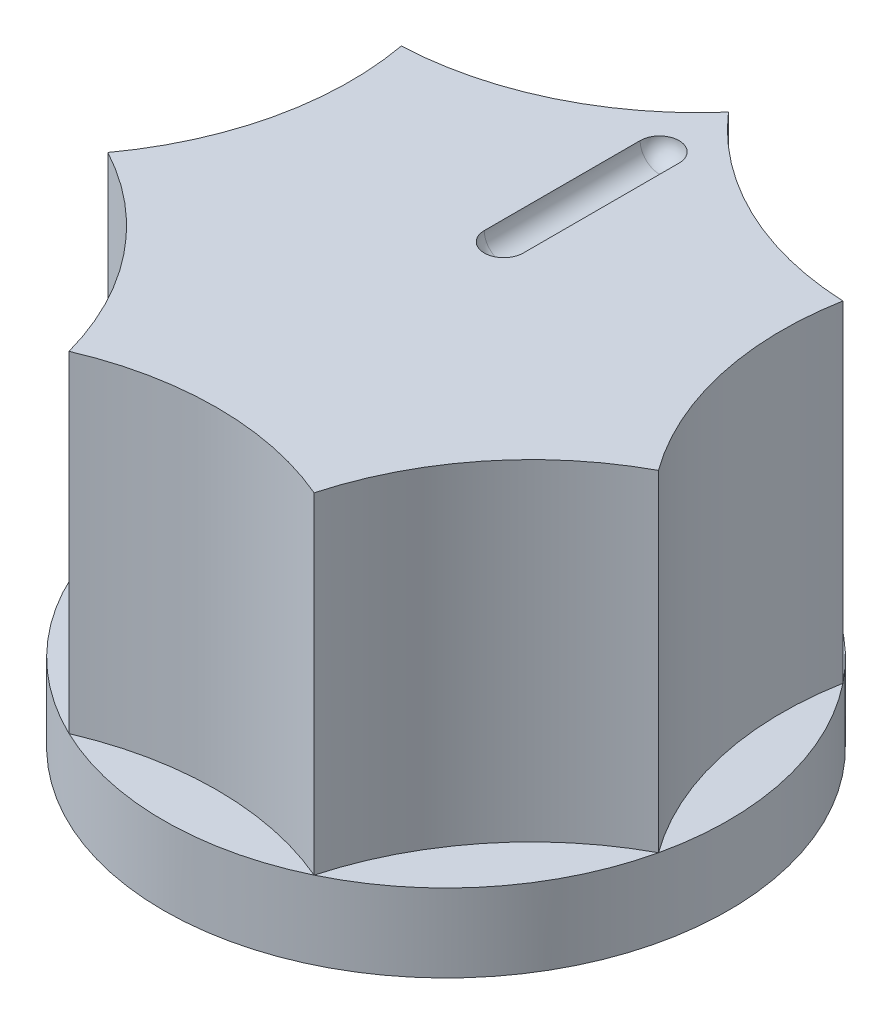
ISO-10303-21;
HEADER;
FILE_DESCRIPTION(('STEP AP214'),'2;1');
FILE_NAME('part.step','',(''),(''),'','','');
FILE_SCHEMA(('AUTOMOTIVE_DESIGN { 1 0 10303 214 1 1 1 1 }'));
ENDSEC;
DATA;
#1=APPLICATION_CONTEXT('core data for automotive mechanical design processes');
#2=APPLICATION_PROTOCOL_DEFINITION('international standard','automotive_design',2000,#1);
#3=PRODUCT_CONTEXT('',#1,'mechanical');
#4=PRODUCT('Part','Part','',(#3));
#5=PRODUCT_RELATED_PRODUCT_CATEGORY('part','',(#4));
#6=PRODUCT_DEFINITION_FORMATION('','',#4);
#7=PRODUCT_DEFINITION_CONTEXT('part definition',#1,'design');
#8=PRODUCT_DEFINITION('design','',#6,#7);
#9=PRODUCT_DEFINITION_SHAPE('','',#8);
#10=(LENGTH_UNIT() NAMED_UNIT(*) SI_UNIT(.MILLI.,.METRE.));
#11=(NAMED_UNIT(*) PLANE_ANGLE_UNIT() SI_UNIT($,.RADIAN.));
#12=(NAMED_UNIT(*) SI_UNIT($,.STERADIAN.) SOLID_ANGLE_UNIT());
#13=UNCERTAINTY_MEASURE_WITH_UNIT(LENGTH_MEASURE(1.E-05),#10,'distance_accuracy_value','');
#14=(GEOMETRIC_REPRESENTATION_CONTEXT(3) GLOBAL_UNCERTAINTY_ASSIGNED_CONTEXT((#13)) GLOBAL_UNIT_ASSIGNED_CONTEXT((#10,
#11,#12)) REPRESENTATION_CONTEXT('',''));
#15=CARTESIAN_POINT('',(0.,0.,0.));
#16=DIRECTION('',(0.,0.,1.));
#17=DIRECTION('',(1.,0.,0.));
#18=AXIS2_PLACEMENT_3D('',#15,#16,#17);
#19=CARTESIAN_POINT('',(0.,2.,0.));
#20=DIRECTION('',(0.,1.,0.));
#21=DIRECTION('',(0.,0.,1.));
#22=AXIS2_PLACEMENT_3D('',#19,#20,#21);
#23=PLANE('',#22);
#24=CARTESIAN_POINT('',(-6.01234166844172,2.,-12.484756118023));
#25=DIRECTION('',(0.,-1.,0.));
#26=DIRECTION('',(0.,0.,1.));
#27=AXIS2_PLACEMENT_3D('',#24,#25,#26);
#28=CIRCLE('',#27,7.97188333791098);
#29=CARTESIAN_POINT('',(0.,2.,-7.25));
#30=VERTEX_POINT('',#29);
#31=CARTESIAN_POINT('',(-5.6682782478931,2.,-4.52030106347596));
#32=VERTEX_POINT('',#31);
#33=EDGE_CURVE('E127',#30,#32,#28,.T.);
#34=ORIENTED_EDGE('',*,*,#33,.F.);
#35=CARTESIAN_POINT('',(0.,2.,0.));
#36=DIRECTION('',(0.,1.,0.));
#37=DIRECTION('',(0.,0.,1.));
#38=AXIS2_PLACEMENT_3D('',#35,#36,#37);
#39=CIRCLE('',#38,7.25);
#40=EDGE_CURVE('E136',#30,#32,#39,.T.);
#41=ORIENTED_EDGE('',*,*,#40,.T.);
#42=EDGE_LOOP('',(#34,#41));
#43=FACE_BOUND('',#42,.T.);
#44=ADVANCED_FACE('F33',(#43),#23,.T.);
#45=CARTESIAN_POINT('',(6.0123416684418,2.,-12.4847561180229));
#46=DIRECTION('',(0.,-1.,0.));
#47=DIRECTION('',(0.,0.,1.));
#48=AXIS2_PLACEMENT_3D('',#45,#46,#47);
#49=CIRCLE('',#48,7.97188333791082);
#50=CARTESIAN_POINT('',(5.66827824789321,2.,-4.52030106347583));
#51=VERTEX_POINT('',#50);
#52=EDGE_CURVE('E179',#51,#30,#49,.T.);
#53=ORIENTED_EDGE('',*,*,#52,.F.);
#54=EDGE_CURVE('E145',#51,#30,#39,.T.);
#55=ORIENTED_EDGE('',*,*,#54,.T.);
#56=EDGE_LOOP('',(#53,#55));
#57=FACE_BOUND('',#56,.T.);
#58=ADVANCED_FACE('F230',(#57),#23,.T.);
#59=CARTESIAN_POINT('',(13.5096090995695,2.,-3.08348011853853));
#60=DIRECTION('',(0.,-1.,0.));
#61=DIRECTION('',(0.,0.,1.));
#62=AXIS2_PLACEMENT_3D('',#59,#60,#61);
#63=CIRCLE('',#62,7.97188333791082);
#64=CARTESIAN_POINT('',(7.06822736331818,2.,1.61327677118343));
#65=VERTEX_POINT('',#64);
#66=EDGE_CURVE('E176',#65,#51,#63,.T.);
#67=ORIENTED_EDGE('',*,*,#66,.F.);
#68=EDGE_CURVE('E199',#65,#51,#39,.T.);
#69=ORIENTED_EDGE('',*,*,#68,.T.);
#70=EDGE_LOOP('',(#67,#69));
#71=FACE_BOUND('',#70,.T.);
#72=ADVANCED_FACE('F235',(#71),#23,.T.);
#73=CARTESIAN_POINT('',(10.8338653329174,2.,8.63971930173714));
#74=DIRECTION('',(0.,-1.,0.));
#75=DIRECTION('',(0.,0.,1.));
#76=AXIS2_PLACEMENT_3D('',#73,#74,#75);
#77=CIRCLE('',#76,7.97188333791087);
#78=CARTESIAN_POINT('',(3.14565710860257,2.,6.5320242922924));
#79=VERTEX_POINT('',#78);
#80=EDGE_CURVE('E173',#79,#65,#77,.T.);
#81=ORIENTED_EDGE('',*,*,#80,.F.);
#82=EDGE_CURVE('E196',#79,#65,#39,.T.);
#83=ORIENTED_EDGE('',*,*,#82,.T.);
#84=EDGE_LOOP('',(#81,#83));
#85=FACE_BOUND('',#84,.T.);
#86=ADVANCED_FACE('F252',(#85),#23,.T.);
#87=CARTESIAN_POINT('',(0.,2.,13.8570338696488));
#88=DIRECTION('',(0.,-1.,0.));
#89=DIRECTION('',(0.,0.,1.));
#90=AXIS2_PLACEMENT_3D('',#87,#88,#89);
#91=CIRCLE('',#90,7.97188333791107);
#92=CARTESIAN_POINT('',(-3.14565710860227,2.,6.53202429229255));
#93=VERTEX_POINT('',#92);
#94=EDGE_CURVE('E170',#93,#79,#91,.T.);
#95=ORIENTED_EDGE('',*,*,#94,.F.);
#96=EDGE_CURVE('E200',#93,#79,#39,.T.);
#97=ORIENTED_EDGE('',*,*,#96,.T.);
#98=EDGE_LOOP('',(#95,#97));
#99=FACE_BOUND('',#98,.T.);
#100=ADVANCED_FACE('F247',(#99),#23,.T.);
#101=CARTESIAN_POINT('',(-10.8338653329172,2.,8.6397193017371));
#102=DIRECTION('',(0.,-1.,0.));
#103=DIRECTION('',(0.,0.,1.));
#104=AXIS2_PLACEMENT_3D('',#101,#102,#103);
#105=CIRCLE('',#104,7.97188333791086);
#106=CARTESIAN_POINT('',(-7.06822736331821,2.,1.6132767711833));
#107=VERTEX_POINT('',#106);
#108=EDGE_CURVE('E126',#107,#93,#105,.T.);
#109=ORIENTED_EDGE('',*,*,#108,.F.);
#110=EDGE_CURVE('E140',#107,#93,#39,.T.);
#111=ORIENTED_EDGE('',*,*,#110,.T.);
#112=EDGE_LOOP('',(#109,#111));
#113=FACE_BOUND('',#112,.T.);
#114=ADVANCED_FACE('F240',(#113),#23,.T.);
#115=CARTESIAN_POINT('',(-13.5096090995695,2.,-3.08348011853849));
#116=DIRECTION('',(0.,-1.,0.));
#117=DIRECTION('',(0.,0.,1.));
#118=AXIS2_PLACEMENT_3D('',#115,#116,#117);
#119=CIRCLE('',#118,7.97188333791101);
#120=EDGE_CURVE('E117',#32,#107,#119,.T.);
#121=ORIENTED_EDGE('',*,*,#120,.F.);
#122=EDGE_CURVE('E120',#32,#107,#39,.T.);
#123=ORIENTED_EDGE('',*,*,#122,.T.);
#124=EDGE_LOOP('',(#121,#123));
#125=FACE_BOUND('',#124,.T.);
#126=ADVANCED_FACE('F119',(#125),#23,.T.);
#127=CARTESIAN_POINT('',(0.,2.,0.));
#128=DIRECTION('',(0.,-1.,0.));
#129=DIRECTION('',(0.,0.,-1.));
#130=AXIS2_PLACEMENT_3D('',#127,#128,#129);
#131=CYLINDRICAL_SURFACE('',#130,7.25);
#132=ORIENTED_EDGE('',*,*,#82,.F.);
#133=ORIENTED_EDGE('',*,*,#96,.F.);
#134=ORIENTED_EDGE('',*,*,#110,.F.);
#135=ORIENTED_EDGE('',*,*,#122,.F.);
#136=ORIENTED_EDGE('',*,*,#40,.F.);
#137=ORIENTED_EDGE('',*,*,#54,.F.);
#138=ORIENTED_EDGE('',*,*,#68,.F.);
#139=EDGE_LOOP('',(#132,#133,#134,#135,#136,#137,#138));
#140=FACE_BOUND('',#139,.T.);
#141=CARTESIAN_POINT('',(0.,0.,0.));
#142=DIRECTION('',(0.,1.,0.));
#143=DIRECTION('',(0.,0.,1.));
#144=AXIS2_PLACEMENT_3D('',#141,#142,#143);
#145=CIRCLE('',#144,7.25);
#146=CARTESIAN_POINT('',(0.,0.,7.25));
#147=VERTEX_POINT('',#146);
#148=EDGE_CURVE('E153',#147,#147,#145,.T.);
#149=ORIENTED_EDGE('',*,*,#148,.T.);
#150=EDGE_LOOP('',(#149));
#151=FACE_BOUND('',#150,.T.);
#152=ADVANCED_FACE('F133',(#140,#151),#131,.T.);
#153=CARTESIAN_POINT('',(0.,0.,0.));
#154=DIRECTION('',(0.,1.,0.));
#155=DIRECTION('',(0.,0.,1.));
#156=AXIS2_PLACEMENT_3D('',#153,#154,#155);
#157=PLANE('',#156);
#158=CARTESIAN_POINT('',(0.,0.,0.));
#159=DIRECTION('',(0.,1.,0.));
#160=DIRECTION('',(0.,0.,1.));
#161=AXIS2_PLACEMENT_3D('',#158,#159,#160);
#162=CIRCLE('',#161,3.5);
#163=CARTESIAN_POINT('',(0.,0.,3.5));
#164=VERTEX_POINT('',#163);
#165=EDGE_CURVE('E11',#164,#164,#162,.T.);
#166=ORIENTED_EDGE('',*,*,#165,.T.);
#167=EDGE_LOOP('',(#166));
#168=FACE_BOUND('',#167,.T.);
#169=ORIENTED_EDGE('',*,*,#148,.F.);
#170=EDGE_LOOP('',(#169));
#171=FACE_BOUND('',#170,.T.);
#172=ADVANCED_FACE('F245',(#168,#171),#157,.F.);
#173=CARTESIAN_POINT('',(-6.01234166844172,10.5,-12.484756118023));
#174=DIRECTION('',(0.,-1.,0.));
#175=DIRECTION('',(0.,0.,-1.));
#176=AXIS2_PLACEMENT_3D('',#173,#174,#175);
#177=CYLINDRICAL_SURFACE('',#176,7.97188333791098);
#178=ORIENTED_EDGE('',*,*,#33,.T.);
#179=DIRECTION('',(0.,-1.,0.));
#180=VECTOR('',#179,1.);
#181=CARTESIAN_POINT('',(-5.66827824789301,10.5,-4.52030106347547));
#182=LINE('',#181,#180);
#183=CARTESIAN_POINT('',(-5.66827824789301,10.5,-4.52030106347547));
#184=VERTEX_POINT('',#183);
#185=EDGE_CURVE('E147',#184,#32,#182,.T.);
#186=ORIENTED_EDGE('',*,*,#185,.F.);
#187=CARTESIAN_POINT('',(-6.01234166844172,10.5,-12.484756118023));
#188=DIRECTION('',(0.,-1.,0.));
#189=DIRECTION('',(0.,0.,1.));
#190=AXIS2_PLACEMENT_3D('',#187,#188,#189);
#191=CIRCLE('',#190,7.97188333791098);
#192=CARTESIAN_POINT('',(0.,10.5,-7.25));
#193=VERTEX_POINT('',#192);
#194=EDGE_CURVE('E182',#193,#184,#191,.T.);
#195=ORIENTED_EDGE('',*,*,#194,.F.);
#196=DIRECTION('',(0.,-1.,0.));
#197=VECTOR('',#196,1.);
#198=CARTESIAN_POINT('',(0.,10.5,-7.25));
#199=LINE('',#198,#197);
#200=EDGE_CURVE('E159',#193,#30,#199,.T.);
#201=ORIENTED_EDGE('',*,*,#200,.T.);
#202=EDGE_LOOP('',(#178,#186,#195,#201));
#203=FACE_BOUND('',#202,.T.);
#204=ADVANCED_FACE('F157',(#203),#177,.F.);
#205=CARTESIAN_POINT('',(-13.5096090995695,10.5,-3.08348011853849));
#206=DIRECTION('',(0.,-1.,0.));
#207=DIRECTION('',(0.,0.,-1.));
#208=AXIS2_PLACEMENT_3D('',#205,#206,#207);
#209=CYLINDRICAL_SURFACE('',#208,7.97188333791101);
#210=ORIENTED_EDGE('',*,*,#120,.T.);
#211=DIRECTION('',(0.,-1.,0.));
#212=VECTOR('',#211,1.);
#213=CARTESIAN_POINT('',(-7.06822736331821,10.5,1.6132767711833));
#214=LINE('',#213,#212);
#215=CARTESIAN_POINT('',(-7.06822736331821,10.5,1.6132767711833));
#216=VERTEX_POINT('',#215);
#217=EDGE_CURVE('E154',#216,#107,#214,.T.);
#218=ORIENTED_EDGE('',*,*,#217,.F.);
#219=CARTESIAN_POINT('',(-13.5096090995695,10.5,-3.08348011853849));
#220=DIRECTION('',(0.,-1.,0.));
#221=DIRECTION('',(0.,0.,1.));
#222=AXIS2_PLACEMENT_3D('',#219,#220,#221);
#223=CIRCLE('',#222,7.97188333791101);
#224=EDGE_CURVE('E149',#184,#216,#223,.T.);
#225=ORIENTED_EDGE('',*,*,#224,.F.);
#226=ORIENTED_EDGE('',*,*,#185,.T.);
#227=EDGE_LOOP('',(#210,#218,#225,#226));
#228=FACE_BOUND('',#227,.T.);
#229=ADVANCED_FACE('F148',(#228),#209,.F.);
#230=CARTESIAN_POINT('',(-10.8338653329172,10.5,8.6397193017371));
#231=DIRECTION('',(0.,-1.,0.));
#232=DIRECTION('',(0.,0.,-1.));
#233=AXIS2_PLACEMENT_3D('',#230,#231,#232);
#234=CYLINDRICAL_SURFACE('',#233,7.97188333791086);
#235=ORIENTED_EDGE('',*,*,#108,.T.);
#236=DIRECTION('',(0.,-1.,0.));
#237=VECTOR('',#236,1.);
#238=CARTESIAN_POINT('',(-3.14565710860235,10.5,6.53202429229235));
#239=LINE('',#238,#237);
#240=CARTESIAN_POINT('',(-3.14565710860235,10.5,6.53202429229235));
#241=VERTEX_POINT('',#240);
#242=EDGE_CURVE('E193',#241,#93,#239,.T.);
#243=ORIENTED_EDGE('',*,*,#242,.F.);
#244=CARTESIAN_POINT('',(-10.8338653329172,10.5,8.6397193017371));
#245=DIRECTION('',(0.,-1.,0.));
#246=DIRECTION('',(0.,0.,1.));
#247=AXIS2_PLACEMENT_3D('',#244,#245,#246);
#248=CIRCLE('',#247,7.97188333791086);
#249=EDGE_CURVE('E266',#216,#241,#248,.T.);
#250=ORIENTED_EDGE('',*,*,#249,.F.);
#251=ORIENTED_EDGE('',*,*,#217,.T.);
#252=EDGE_LOOP('',(#235,#243,#250,#251));
#253=FACE_BOUND('',#252,.T.);
#254=ADVANCED_FACE('F256',(#253),#234,.F.);
#255=CARTESIAN_POINT('',(0.,10.5,13.8570338696488));
#256=DIRECTION('',(0.,-1.,0.));
#257=DIRECTION('',(0.,0.,-1.));
#258=AXIS2_PLACEMENT_3D('',#255,#256,#257);
#259=CYLINDRICAL_SURFACE('',#258,7.97188333791107);
#260=ORIENTED_EDGE('',*,*,#94,.T.);
#261=DIRECTION('',(0.,-1.,0.));
#262=VECTOR('',#261,1.);
#263=CARTESIAN_POINT('',(3.14565710860255,10.5,6.53202429229219));
#264=LINE('',#263,#262);
#265=CARTESIAN_POINT('',(3.14565710860255,10.5,6.53202429229219));
#266=VERTEX_POINT('',#265);
#267=EDGE_CURVE('E190',#266,#79,#264,.T.);
#268=ORIENTED_EDGE('',*,*,#267,.F.);
#269=CARTESIAN_POINT('',(0.,10.5,13.8570338696488));
#270=DIRECTION('',(0.,-1.,0.));
#271=DIRECTION('',(0.,0.,1.));
#272=AXIS2_PLACEMENT_3D('',#269,#270,#271);
#273=CIRCLE('',#272,7.97188333791107);
#274=EDGE_CURVE('E262',#241,#266,#273,.T.);
#275=ORIENTED_EDGE('',*,*,#274,.F.);
#276=ORIENTED_EDGE('',*,*,#242,.T.);
#277=EDGE_LOOP('',(#260,#268,#275,#276));
#278=FACE_BOUND('',#277,.T.);
#279=ADVANCED_FACE('F260',(#278),#259,.F.);
#280=CARTESIAN_POINT('',(10.8338653329174,10.5,8.63971930173714));
#281=DIRECTION('',(0.,-1.,0.));
#282=DIRECTION('',(0.,0.,-1.));
#283=AXIS2_PLACEMENT_3D('',#280,#281,#282);
#284=CYLINDRICAL_SURFACE('',#283,7.97188333791087);
#285=ORIENTED_EDGE('',*,*,#80,.T.);
#286=DIRECTION('',(0.,-1.,0.));
#287=VECTOR('',#286,1.);
#288=CARTESIAN_POINT('',(7.06822736331821,10.5,1.61327677118326));
#289=LINE('',#288,#287);
#290=CARTESIAN_POINT('',(7.06822736331821,10.5,1.61327677118326));
#291=VERTEX_POINT('',#290);
#292=EDGE_CURVE('E187',#291,#65,#289,.T.);
#293=ORIENTED_EDGE('',*,*,#292,.F.);
#294=CARTESIAN_POINT('',(10.8338653329174,10.5,8.63971930173714));
#295=DIRECTION('',(0.,-1.,0.));
#296=DIRECTION('',(0.,0.,1.));
#297=AXIS2_PLACEMENT_3D('',#294,#295,#296);
#298=CIRCLE('',#297,7.97188333791087);
#299=EDGE_CURVE('E265',#266,#291,#298,.T.);
#300=ORIENTED_EDGE('',*,*,#299,.F.);
#301=ORIENTED_EDGE('',*,*,#267,.T.);
#302=EDGE_LOOP('',(#285,#293,#300,#301));
#303=FACE_BOUND('',#302,.T.);
#304=ADVANCED_FACE('F303',(#303),#284,.F.);
#305=CARTESIAN_POINT('',(13.5096090995695,10.5,-3.08348011853853));
#306=DIRECTION('',(0.,-1.,0.));
#307=DIRECTION('',(0.,0.,-1.));
#308=AXIS2_PLACEMENT_3D('',#305,#306,#307);
#309=CYLINDRICAL_SURFACE('',#308,7.97188333791082);
#310=ORIENTED_EDGE('',*,*,#66,.T.);
#311=DIRECTION('',(0.,-1.,0.));
#312=VECTOR('',#311,1.);
#313=CARTESIAN_POINT('',(5.6682782478932,10.5,-4.52030106347583));
#314=LINE('',#313,#312);
#315=CARTESIAN_POINT('',(5.6682782478932,10.5,-4.52030106347583));
#316=VERTEX_POINT('',#315);
#317=EDGE_CURVE('E184',#316,#51,#314,.T.);
#318=ORIENTED_EDGE('',*,*,#317,.F.);
#319=CARTESIAN_POINT('',(13.5096090995695,10.5,-3.08348011853853));
#320=DIRECTION('',(0.,-1.,0.));
#321=DIRECTION('',(0.,0.,1.));
#322=AXIS2_PLACEMENT_3D('',#319,#320,#321);
#323=CIRCLE('',#322,7.97188333791082);
#324=EDGE_CURVE('E268',#291,#316,#323,.T.);
#325=ORIENTED_EDGE('',*,*,#324,.F.);
#326=ORIENTED_EDGE('',*,*,#292,.T.);
#327=EDGE_LOOP('',(#310,#318,#325,#326));
#328=FACE_BOUND('',#327,.T.);
#329=ADVANCED_FACE('F300',(#328),#309,.F.);
#330=CARTESIAN_POINT('',(6.0123416684418,10.5,-12.4847561180229));
#331=DIRECTION('',(0.,-1.,0.));
#332=DIRECTION('',(0.,0.,-1.));
#333=AXIS2_PLACEMENT_3D('',#330,#331,#332);
#334=CYLINDRICAL_SURFACE('',#333,7.97188333791082);
#335=ORIENTED_EDGE('',*,*,#52,.T.);
#336=ORIENTED_EDGE('',*,*,#200,.F.);
#337=CARTESIAN_POINT('',(6.0123416684418,10.5,-12.4847561180229));
#338=DIRECTION('',(0.,-1.,0.));
#339=DIRECTION('',(0.,0.,1.));
#340=AXIS2_PLACEMENT_3D('',#337,#338,#339);
#341=CIRCLE('',#340,7.97188333791082);
#342=EDGE_CURVE('E165',#316,#193,#341,.T.);
#343=ORIENTED_EDGE('',*,*,#342,.F.);
#344=ORIENTED_EDGE('',*,*,#317,.T.);
#345=EDGE_LOOP('',(#335,#336,#343,#344));
#346=FACE_BOUND('',#345,.T.);
#347=ADVANCED_FACE('F277',(#346),#334,.F.);
#348=CARTESIAN_POINT('',(0.,10.5,-12.4847561180229));
#349=DIRECTION('',(0.,1.,0.));
#350=DIRECTION('',(0.,0.,1.));
#351=AXIS2_PLACEMENT_3D('',#348,#349,#350);
#352=PLANE('',#351);
#353=CARTESIAN_POINT('',(0.,10.5,-5.48277558420058));
#354=DIRECTION('',(0.,1.,0.));
#355=DIRECTION('',(0.,0.,1.));
#356=AXIS2_PLACEMENT_3D('',#353,#354,#355);
#357=CIRCLE('',#356,0.5);
#358=CARTESIAN_POINT('',(0.5,10.5,-5.48277558420058));
#359=VERTEX_POINT('',#358);
#360=CARTESIAN_POINT('',(-0.5,10.5,-5.48277558420058));
#361=VERTEX_POINT('',#360);
#362=EDGE_CURVE('E213',#359,#361,#357,.T.);
#363=ORIENTED_EDGE('',*,*,#362,.F.);
#364=DIRECTION('',(0.,0.,-1.));
#365=VECTOR('',#364,1.);
#366=CARTESIAN_POINT('',(0.5,10.5,-5.48277558420058));
#367=LINE('',#366,#365);
#368=CARTESIAN_POINT('',(0.500000000000001,10.5,-1.48277558420058));
#369=VERTEX_POINT('',#368);
#370=EDGE_CURVE('E160',#369,#359,#367,.T.);
#371=ORIENTED_EDGE('',*,*,#370,.F.);
#372=CARTESIAN_POINT('',(0.,10.5,-1.48277558420058));
#373=DIRECTION('',(0.,1.,0.));
#374=DIRECTION('',(0.,0.,1.));
#375=AXIS2_PLACEMENT_3D('',#372,#373,#374);
#376=CIRCLE('',#375,0.5);
#377=CARTESIAN_POINT('',(-0.5,10.5,-1.48277558420058));
#378=VERTEX_POINT('',#377);
#379=EDGE_CURVE('E73',#378,#369,#376,.T.);
#380=ORIENTED_EDGE('',*,*,#379,.F.);
#381=DIRECTION('',(0.,0.,1.));
#382=VECTOR('',#381,1.);
#383=CARTESIAN_POINT('',(-0.5,10.5,-5.48277558420058));
#384=LINE('',#383,#382);
#385=EDGE_CURVE('E50',#361,#378,#384,.T.);
#386=ORIENTED_EDGE('',*,*,#385,.F.);
#387=EDGE_LOOP('',(#363,#371,#380,#386));
#388=FACE_BOUND('',#387,.T.);
#389=ORIENTED_EDGE('',*,*,#194,.T.);
#390=ORIENTED_EDGE('',*,*,#224,.T.);
#391=ORIENTED_EDGE('',*,*,#249,.T.);
#392=ORIENTED_EDGE('',*,*,#274,.T.);
#393=ORIENTED_EDGE('',*,*,#299,.T.);
#394=ORIENTED_EDGE('',*,*,#324,.T.);
#395=ORIENTED_EDGE('',*,*,#342,.T.);
#396=EDGE_LOOP('',(#389,#390,#391,#392,#393,#394,#395));
#397=FACE_BOUND('',#396,.T.);
#398=ADVANCED_FACE('F275',(#388,#397),#352,.T.);
#399=CARTESIAN_POINT('',(0.,10.5,-1.48277558420058));
#400=DIRECTION('',(0.,1.,0.));
#401=DIRECTION('',(0.,0.,1.));
#402=AXIS2_PLACEMENT_3D('',#399,#400,#401);
#403=SPHERICAL_SURFACE('',#402,0.5);
#404=CARTESIAN_POINT('',(0.,10.5,-1.48277558420058));
#405=DIRECTION('',(0.,0.,1.));
#406=DIRECTION('',(1.,0.,0.));
#407=AXIS2_PLACEMENT_3D('',#404,#405,#406);
#408=CIRCLE('',#407,0.5);
#409=CARTESIAN_POINT('',(0.,10.,-1.48277558420058));
#410=VERTEX_POINT('',#409);
#411=EDGE_CURVE('E67',#378,#410,#408,.T.);
#412=ORIENTED_EDGE('',*,*,#411,.F.);
#413=ORIENTED_EDGE('',*,*,#379,.T.);
#414=CARTESIAN_POINT('',(0.,10.5,-1.48277558420058));
#415=DIRECTION('',(0.,0.,1.));
#416=DIRECTION('',(1.,0.,0.));
#417=AXIS2_PLACEMENT_3D('',#414,#415,#416);
#418=CIRCLE('',#417,0.5);
#419=EDGE_CURVE('E210',#410,#369,#418,.T.);
#420=ORIENTED_EDGE('',*,*,#419,.F.);
#421=EDGE_LOOP('',(#412,#413,#420));
#422=FACE_BOUND('',#421,.T.);
#423=ADVANCED_FACE('F297',(#422),#403,.F.);
#424=CARTESIAN_POINT('',(0.,10.5,-5.48277558420058));
#425=DIRECTION('',(0.,0.,1.));
#426=DIRECTION('',(1.,0.,0.));
#427=AXIS2_PLACEMENT_3D('',#424,#425,#426);
#428=CYLINDRICAL_SURFACE('',#427,0.5);
#429=CARTESIAN_POINT('',(0.,10.5,-5.48277558420058));
#430=DIRECTION('',(0.,0.,1.));
#431=DIRECTION('',(1.,0.,0.));
#432=AXIS2_PLACEMENT_3D('',#429,#430,#431);
#433=CIRCLE('',#432,0.5);
#434=CARTESIAN_POINT('',(0.,10.,-5.48277558420058));
#435=VERTEX_POINT('',#434);
#436=EDGE_CURVE('E61',#361,#435,#433,.T.);
#437=ORIENTED_EDGE('',*,*,#436,.F.);
#438=ORIENTED_EDGE('',*,*,#385,.T.);
#439=ORIENTED_EDGE('',*,*,#411,.T.);
#440=DIRECTION('',(0.,0.,1.));
#441=VECTOR('',#440,1.);
#442=CARTESIAN_POINT('',(0.,10.,-5.48277558420058));
#443=LINE('',#442,#441);
#444=EDGE_CURVE('E206',#435,#410,#443,.T.);
#445=ORIENTED_EDGE('',*,*,#444,.F.);
#446=EDGE_LOOP('',(#437,#438,#439,#445));
#447=FACE_BOUND('',#446,.T.);
#448=ADVANCED_FACE('F325',(#447),#428,.F.);
#449=CARTESIAN_POINT('',(0.,10.5,-5.48277558420058));
#450=DIRECTION('',(0.,1.,0.));
#451=DIRECTION('',(0.,0.,1.));
#452=AXIS2_PLACEMENT_3D('',#449,#450,#451);
#453=SPHERICAL_SURFACE('',#452,0.5);
#454=ORIENTED_EDGE('',*,*,#362,.T.);
#455=ORIENTED_EDGE('',*,*,#436,.T.);
#456=CARTESIAN_POINT('',(0.,10.5,-5.48277558420058));
#457=DIRECTION('',(0.,0.,-1.));
#458=DIRECTION('',(-1.,0.,0.));
#459=AXIS2_PLACEMENT_3D('',#456,#457,#458);
#460=CIRCLE('',#459,0.5);
#461=EDGE_CURVE('E203',#359,#435,#460,.T.);
#462=ORIENTED_EDGE('',*,*,#461,.F.);
#463=EDGE_LOOP('',(#454,#455,#462));
#464=FACE_BOUND('',#463,.T.);
#465=ADVANCED_FACE('F291',(#464),#453,.F.);
#466=CARTESIAN_POINT('',(0.,10.5,-5.48277558420058));
#467=DIRECTION('',(0.,0.,-1.));
#468=DIRECTION('',(-1.,0.,0.));
#469=AXIS2_PLACEMENT_3D('',#466,#467,#468);
#470=CYLINDRICAL_SURFACE('',#469,0.5);
#471=ORIENTED_EDGE('',*,*,#419,.T.);
#472=ORIENTED_EDGE('',*,*,#370,.T.);
#473=ORIENTED_EDGE('',*,*,#461,.T.);
#474=ORIENTED_EDGE('',*,*,#444,.T.);
#475=EDGE_LOOP('',(#471,#472,#473,#474));
#476=FACE_BOUND('',#475,.T.);
#477=ADVANCED_FACE('F286',(#476),#470,.F.);
#478=CARTESIAN_POINT('',(0.,8.,0.));
#479=DIRECTION('',(0.,-1.,0.));
#480=DIRECTION('',(0.,0.,-1.));
#481=AXIS2_PLACEMENT_3D('',#478,#479,#480);
#482=CYLINDRICAL_SURFACE('',#481,3.);
#483=CARTESIAN_POINT('',(0.,0.5,0.));
#484=DIRECTION('',(0.,1.,0.));
#485=DIRECTION('',(0.,0.,1.));
#486=AXIS2_PLACEMENT_3D('',#483,#484,#485);
#487=CIRCLE('',#486,3.);
#488=CARTESIAN_POINT('',(0.,0.5,3.));
#489=VERTEX_POINT('',#488);
#490=EDGE_CURVE('E42',#489,#489,#487,.F.);
#491=ORIENTED_EDGE('',*,*,#490,.T.);
#492=EDGE_LOOP('',(#491));
#493=FACE_BOUND('',#492,.T.);
#494=CARTESIAN_POINT('',(0.,8.,0.));
#495=DIRECTION('',(0.,-1.,0.));
#496=DIRECTION('',(0.,0.,-1.));
#497=AXIS2_PLACEMENT_3D('',#494,#495,#496);
#498=CIRCLE('',#497,3.);
#499=CARTESIAN_POINT('',(0.,8.,-3.));
#500=VERTEX_POINT('',#499);
#501=EDGE_CURVE('E207',#500,#500,#498,.T.);
#502=ORIENTED_EDGE('',*,*,#501,.F.);
#503=EDGE_LOOP('',(#502));
#504=FACE_BOUND('',#503,.T.);
#505=ADVANCED_FACE('F217',(#493,#504),#482,.F.);
#506=CARTESIAN_POINT('',(0.,8.,0.));
#507=DIRECTION('',(0.,-1.,0.));
#508=DIRECTION('',(0.,0.,-1.));
#509=AXIS2_PLACEMENT_3D('',#506,#507,#508);
#510=PLANE('',#509);
#511=ORIENTED_EDGE('',*,*,#501,.T.);
#512=EDGE_LOOP('',(#511));
#513=FACE_BOUND('',#512,.T.);
#514=ADVANCED_FACE('F221',(#513),#510,.T.);
#515=CARTESIAN_POINT('',(0.,0.5,0.));
#516=DIRECTION('',(0.,-1.,0.));
#517=DIRECTION('',(0.,0.,-1.));
#518=AXIS2_PLACEMENT_3D('',#515,#516,#517);
#519=CONICAL_SURFACE('',#518,3.,0.785398163397448);
#520=ORIENTED_EDGE('',*,*,#165,.F.);
#521=EDGE_LOOP('',(#520));
#522=FACE_BOUND('',#521,.T.);
#523=ORIENTED_EDGE('',*,*,#490,.F.);
#524=EDGE_LOOP('',(#523));
#525=FACE_BOUND('',#524,.T.);
#526=ADVANCED_FACE('F35',(#522,#525),#519,.F.);
#527=CLOSED_SHELL('',(#44,#58,#72,#86,#100,#114,#126,#152,#172,#204,#229,#254,#279,#304,#329,
#347,#398,#423,#448,#465,#477,#505,#514,#526));
#528=MANIFOLD_SOLID_BREP('B2',#527);
#529=ADVANCED_BREP_SHAPE_REPRESENTATION('',(#18,#528),#14);
#530=SHAPE_DEFINITION_REPRESENTATION(#9,#529);
ENDSEC;
END-ISO-10303-21;
